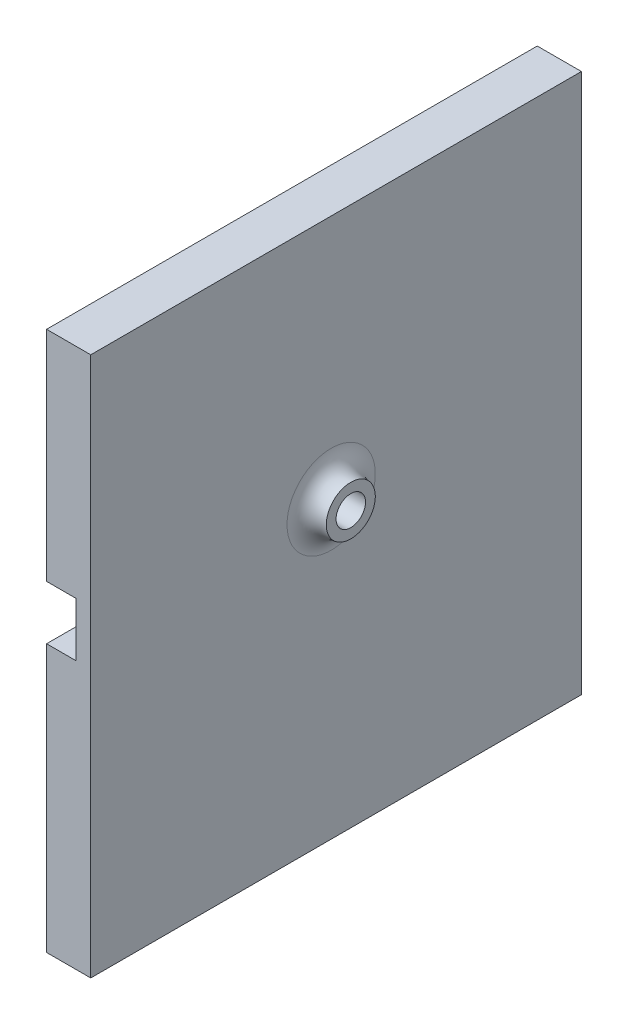
ISO-10303-21;
HEADER;
FILE_DESCRIPTION(('STEP AP214'),'2;1');
FILE_NAME('part.step','',(''),(''),'','','');
FILE_SCHEMA(('AUTOMOTIVE_DESIGN { 1 0 10303 214 1 1 1 1 }'));
ENDSEC;
DATA;
#1=APPLICATION_CONTEXT('core data for automotive mechanical design processes');
#2=APPLICATION_PROTOCOL_DEFINITION('international standard','automotive_design',2000,#1);
#3=PRODUCT_CONTEXT('',#1,'mechanical');
#4=PRODUCT('Part','Part','',(#3));
#5=PRODUCT_RELATED_PRODUCT_CATEGORY('part','',(#4));
#6=PRODUCT_DEFINITION_FORMATION('','',#4);
#7=PRODUCT_DEFINITION_CONTEXT('part definition',#1,'design');
#8=PRODUCT_DEFINITION('design','',#6,#7);
#9=PRODUCT_DEFINITION_SHAPE('','',#8);
#10=(LENGTH_UNIT() NAMED_UNIT(*) SI_UNIT(.MILLI.,.METRE.));
#11=(NAMED_UNIT(*) PLANE_ANGLE_UNIT() SI_UNIT($,.RADIAN.));
#12=(NAMED_UNIT(*) SI_UNIT($,.STERADIAN.) SOLID_ANGLE_UNIT());
#13=UNCERTAINTY_MEASURE_WITH_UNIT(LENGTH_MEASURE(1.E-05),#10,'distance_accuracy_value','');
#14=(GEOMETRIC_REPRESENTATION_CONTEXT(3) GLOBAL_UNCERTAINTY_ASSIGNED_CONTEXT((#13)) GLOBAL_UNIT_ASSIGNED_CONTEXT((#10,
#11,#12)) REPRESENTATION_CONTEXT('',''));
#15=CARTESIAN_POINT('',(0.,0.,0.));
#16=DIRECTION('',(0.,0.,1.));
#17=DIRECTION('',(1.,0.,0.));
#18=AXIS2_PLACEMENT_3D('',#15,#16,#17);
#19=CARTESIAN_POINT('',(37.,-10.,60.));
#20=DIRECTION('',(1.,0.,0.));
#21=DIRECTION('',(0.,0.,-1.));
#22=AXIS2_PLACEMENT_3D('',#19,#20,#21);
#23=PLANE('',#22);
#24=CARTESIAN_POINT('',(37.,-10.,60.));
#25=DIRECTION('',(1.,0.,0.));
#26=DIRECTION('',(0.,0.,-1.));
#27=AXIS2_PLACEMENT_3D('',#24,#25,#26);
#28=CIRCLE('',#27,1.5);
#29=CARTESIAN_POINT('',(37.,-10.,58.5));
#30=VERTEX_POINT('',#29);
#31=EDGE_CURVE('E137',#30,#30,#28,.T.);
#32=ORIENTED_EDGE('',*,*,#31,.F.);
#33=EDGE_LOOP('',(#32));
#34=FACE_BOUND('',#33,.T.);
#35=CARTESIAN_POINT('',(37.,-10.,60.));
#36=DIRECTION('',(1.,0.,0.));
#37=DIRECTION('',(0.,0.,-1.));
#38=AXIS2_PLACEMENT_3D('',#35,#36,#37);
#39=CIRCLE('',#38,2.5);
#40=CARTESIAN_POINT('',(37.,-10.,57.5));
#41=VERTEX_POINT('',#40);
#42=EDGE_CURVE('E141',#41,#41,#39,.T.);
#43=ORIENTED_EDGE('',*,*,#42,.T.);
#44=EDGE_LOOP('',(#43));
#45=FACE_BOUND('',#44,.T.);
#46=ADVANCED_FACE('F50',(#34,#45),#23,.T.);
#47=CARTESIAN_POINT('',(-35.,-10.,60.));
#48=DIRECTION('',(1.,0.,0.));
#49=DIRECTION('',(0.,0.,-1.));
#50=AXIS2_PLACEMENT_3D('',#47,#48,#49);
#51=CYLINDRICAL_SURFACE('',#50,1.5);
#52=CARTESIAN_POINT('',(33.5,-10.,60.));
#53=DIRECTION('',(1.,0.,0.));
#54=DIRECTION('',(0.,0.,-1.));
#55=AXIS2_PLACEMENT_3D('',#52,#53,#54);
#56=CIRCLE('',#55,1.5);
#57=CARTESIAN_POINT('',(33.5,-10.,58.5));
#58=VERTEX_POINT('',#57);
#59=EDGE_CURVE('E173',#58,#58,#56,.F.);
#60=ORIENTED_EDGE('',*,*,#59,.T.);
#61=EDGE_LOOP('',(#60));
#62=FACE_BOUND('',#61,.T.);
#63=ORIENTED_EDGE('',*,*,#31,.T.);
#64=EDGE_LOOP('',(#63));
#65=FACE_BOUND('',#64,.T.);
#66=ADVANCED_FACE('F247',(#62,#65),#51,.F.);
#67=CARTESIAN_POINT('',(37.,-10.,60.));
#68=DIRECTION('',(-1.,0.,0.));
#69=DIRECTION('',(0.,0.,1.));
#70=AXIS2_PLACEMENT_3D('',#67,#68,#69);
#71=TOROIDAL_SURFACE('',#70,4.5,2.);
#72=CARTESIAN_POINT('',(35.,-10.,60.));
#73=DIRECTION('',(-1.,0.,0.));
#74=DIRECTION('',(0.,0.,1.));
#75=AXIS2_PLACEMENT_3D('',#72,#73,#74);
#76=CIRCLE('',#75,4.5);
#77=CARTESIAN_POINT('',(35.,-10.,64.5));
#78=VERTEX_POINT('',#77);
#79=EDGE_CURVE('E205',#78,#78,#76,.T.);
#80=ORIENTED_EDGE('',*,*,#79,.F.);
#81=EDGE_LOOP('',(#80));
#82=FACE_BOUND('',#81,.T.);
#83=ORIENTED_EDGE('',*,*,#42,.F.);
#84=EDGE_LOOP('',(#83));
#85=FACE_BOUND('',#84,.T.);
#86=ADVANCED_FACE('F52',(#82,#85),#71,.F.);
#87=CARTESIAN_POINT('',(0.,0.,54.5));
#88=DIRECTION('',(0.,0.,1.));
#89=DIRECTION('',(1.,0.,0.));
#90=AXIS2_PLACEMENT_3D('',#87,#88,#89);
#91=PLANE('',#90);
#92=DIRECTION('',(0.,-1.,0.));
#93=VECTOR('',#92,1.);
#94=CARTESIAN_POINT('',(30.5,-7.25,54.5));
#95=LINE('',#94,#93);
#96=CARTESIAN_POINT('',(30.5,-7.25,54.5));
#97=VERTEX_POINT('',#96);
#98=CARTESIAN_POINT('',(30.5,-12.75,54.5));
#99=VERTEX_POINT('',#98);
#100=EDGE_CURVE('E166',#97,#99,#95,.T.);
#101=ORIENTED_EDGE('',*,*,#100,.T.);
#102=DIRECTION('',(1.,0.,0.));
#103=VECTOR('',#102,1.);
#104=CARTESIAN_POINT('',(30.5,-12.75,54.5));
#105=LINE('',#104,#103);
#106=CARTESIAN_POINT('',(33.5,-12.75,54.5));
#107=VERTEX_POINT('',#106);
#108=EDGE_CURVE('E181',#99,#107,#105,.T.);
#109=ORIENTED_EDGE('',*,*,#108,.T.);
#110=DIRECTION('',(0.,1.,0.));
#111=VECTOR('',#110,1.);
#112=CARTESIAN_POINT('',(33.5,-7.25,54.5));
#113=LINE('',#112,#111);
#114=CARTESIAN_POINT('',(33.5,-7.25,54.5));
#115=VERTEX_POINT('',#114);
#116=EDGE_CURVE('E177',#107,#115,#113,.T.);
#117=ORIENTED_EDGE('',*,*,#116,.T.);
#118=DIRECTION('',(-1.,0.,0.));
#119=VECTOR('',#118,1.);
#120=CARTESIAN_POINT('',(30.5,-7.25,54.5));
#121=LINE('',#120,#119);
#122=EDGE_CURVE('E151',#115,#97,#121,.T.);
#123=ORIENTED_EDGE('',*,*,#122,.T.);
#124=EDGE_LOOP('',(#101,#109,#117,#123));
#125=FACE_BOUND('',#124,.T.);
#126=ADVANCED_FACE('F223',(#125),#91,.T.);
#127=CARTESIAN_POINT('',(30.5,-12.75,54.5));
#128=DIRECTION('',(0.,-1.,0.));
#129=DIRECTION('',(1.,0.,0.));
#130=AXIS2_PLACEMENT_3D('',#127,#128,#129);
#131=PLANE('',#130);
#132=DIRECTION('',(1.,0.,0.));
#133=VECTOR('',#132,1.);
#134=CARTESIAN_POINT('',(30.5,-12.75,84.5));
#135=LINE('',#134,#133);
#136=CARTESIAN_POINT('',(30.5,-12.75,84.5));
#137=VERTEX_POINT('',#136);
#138=CARTESIAN_POINT('',(33.5,-12.75,84.5));
#139=VERTEX_POINT('',#138);
#140=EDGE_CURVE('E170',#137,#139,#135,.T.);
#141=ORIENTED_EDGE('',*,*,#140,.T.);
#142=DIRECTION('',(0.,0.,1.));
#143=VECTOR('',#142,1.);
#144=CARTESIAN_POINT('',(33.5,-12.75,54.5));
#145=LINE('',#144,#143);
#146=EDGE_CURVE('E152',#107,#139,#145,.T.);
#147=ORIENTED_EDGE('',*,*,#146,.F.);
#148=ORIENTED_EDGE('',*,*,#108,.F.);
#149=DIRECTION('',(0.,0.,1.));
#150=VECTOR('',#149,1.);
#151=CARTESIAN_POINT('',(30.5,-12.75,54.5));
#152=LINE('',#151,#150);
#153=EDGE_CURVE('E74',#99,#137,#152,.T.);
#154=ORIENTED_EDGE('',*,*,#153,.T.);
#155=EDGE_LOOP('',(#141,#147,#148,#154));
#156=FACE_BOUND('',#155,.T.);
#157=ADVANCED_FACE('F260',(#156),#131,.F.);
#158=CARTESIAN_POINT('',(33.5,-7.25,54.5));
#159=DIRECTION('',(1.,0.,0.));
#160=DIRECTION('',(0.,0.,-1.));
#161=AXIS2_PLACEMENT_3D('',#158,#159,#160);
#162=PLANE('',#161);
#163=DIRECTION('',(0.,1.,0.));
#164=VECTOR('',#163,1.);
#165=CARTESIAN_POINT('',(33.5,-7.25,84.5));
#166=LINE('',#165,#164);
#167=CARTESIAN_POINT('',(33.5,-7.25,84.5));
#168=VERTEX_POINT('',#167);
#169=EDGE_CURVE('E165',#139,#168,#166,.T.);
#170=ORIENTED_EDGE('',*,*,#169,.T.);
#171=DIRECTION('',(0.,0.,1.));
#172=VECTOR('',#171,1.);
#173=CARTESIAN_POINT('',(33.5,-7.25,54.5));
#174=LINE('',#173,#172);
#175=EDGE_CURVE('E155',#115,#168,#174,.T.);
#176=ORIENTED_EDGE('',*,*,#175,.F.);
#177=ORIENTED_EDGE('',*,*,#116,.F.);
#178=ORIENTED_EDGE('',*,*,#146,.T.);
#179=EDGE_LOOP('',(#170,#176,#177,#178));
#180=FACE_BOUND('',#179,.T.);
#181=ORIENTED_EDGE('',*,*,#59,.F.);
#182=EDGE_LOOP('',(#181));
#183=FACE_BOUND('',#182,.T.);
#184=ADVANCED_FACE('F226',(#180,#183),#162,.F.);
#185=CARTESIAN_POINT('',(30.5,-7.25,54.5));
#186=DIRECTION('',(0.,1.,0.));
#187=DIRECTION('',(0.,0.,1.));
#188=AXIS2_PLACEMENT_3D('',#185,#186,#187);
#189=PLANE('',#188);
#190=DIRECTION('',(-1.,0.,0.));
#191=VECTOR('',#190,1.);
#192=CARTESIAN_POINT('',(30.5,-7.25,84.5));
#193=LINE('',#192,#191);
#194=CARTESIAN_POINT('',(30.5,-7.25,84.5));
#195=VERTEX_POINT('',#194);
#196=EDGE_CURVE('E161',#168,#195,#193,.T.);
#197=ORIENTED_EDGE('',*,*,#196,.T.);
#198=DIRECTION('',(0.,0.,1.));
#199=VECTOR('',#198,1.);
#200=CARTESIAN_POINT('',(30.5,-7.25,54.5));
#201=LINE('',#200,#199);
#202=EDGE_CURVE('E148',#97,#195,#201,.T.);
#203=ORIENTED_EDGE('',*,*,#202,.F.);
#204=ORIENTED_EDGE('',*,*,#122,.F.);
#205=ORIENTED_EDGE('',*,*,#175,.T.);
#206=EDGE_LOOP('',(#197,#203,#204,#205));
#207=FACE_BOUND('',#206,.T.);
#208=ADVANCED_FACE('F221',(#207),#189,.F.);
#209=CARTESIAN_POINT('',(0.,0.,84.5));
#210=DIRECTION('',(0.,0.,-1.));
#211=DIRECTION('',(-1.,0.,0.));
#212=AXIS2_PLACEMENT_3D('',#209,#210,#211);
#213=PLANE('',#212);
#214=DIRECTION('',(0.,1.,0.));
#215=VECTOR('',#214,1.);
#216=CARTESIAN_POINT('',(35.,40.,84.5));
#217=LINE('',#216,#215);
#218=CARTESIAN_POINT('',(35.,-40.,84.5));
#219=VERTEX_POINT('',#218);
#220=CARTESIAN_POINT('',(35.,15.,84.5));
#221=VERTEX_POINT('',#220);
#222=EDGE_CURVE('E196',#219,#221,#217,.T.);
#223=ORIENTED_EDGE('',*,*,#222,.T.);
#224=DIRECTION('',(-1.,0.,0.));
#225=VECTOR('',#224,1.);
#226=CARTESIAN_POINT('',(0.,15.,84.5));
#227=LINE('',#226,#225);
#228=CARTESIAN_POINT('',(30.5,15.,84.5));
#229=VERTEX_POINT('',#228);
#230=EDGE_CURVE('E59',#221,#229,#227,.T.);
#231=ORIENTED_EDGE('',*,*,#230,.T.);
#232=DIRECTION('',(0.,-1.,0.));
#233=VECTOR('',#232,1.);
#234=CARTESIAN_POINT('',(30.5,-40.,84.5));
#235=LINE('',#234,#233);
#236=EDGE_CURVE('E188',#229,#195,#235,.T.);
#237=ORIENTED_EDGE('',*,*,#236,.T.);
#238=ORIENTED_EDGE('',*,*,#196,.F.);
#239=ORIENTED_EDGE('',*,*,#169,.F.);
#240=ORIENTED_EDGE('',*,*,#140,.F.);
#241=CARTESIAN_POINT('',(30.5,-40.,84.5));
#242=VERTEX_POINT('',#241);
#243=EDGE_CURVE('E192',#137,#242,#235,.T.);
#244=ORIENTED_EDGE('',*,*,#243,.T.);
#245=DIRECTION('',(1.,0.,0.));
#246=VECTOR('',#245,1.);
#247=CARTESIAN_POINT('',(35.,-40.,84.5));
#248=LINE('',#247,#246);
#249=EDGE_CURVE('E191',#242,#219,#248,.T.);
#250=ORIENTED_EDGE('',*,*,#249,.T.);
#251=EDGE_LOOP('',(#223,#231,#237,#238,#239,#240,#244,#250));
#252=FACE_BOUND('',#251,.T.);
#253=ADVANCED_FACE('F214',(#252),#213,.F.);
#254=CARTESIAN_POINT('',(30.5,-40.,84.5));
#255=DIRECTION('',(1.,0.,0.));
#256=DIRECTION('',(0.,1.,0.));
#257=AXIS2_PLACEMENT_3D('',#254,#255,#256);
#258=PLANE('',#257);
#259=ORIENTED_EDGE('',*,*,#236,.F.);
#260=DIRECTION('',(0.,0.,-1.));
#261=VECTOR('',#260,1.);
#262=CARTESIAN_POINT('',(30.5,15.,84.5));
#263=LINE('',#262,#261);
#264=CARTESIAN_POINT('',(30.5,15.,34.5));
#265=VERTEX_POINT('',#264);
#266=EDGE_CURVE('E66',#229,#265,#263,.T.);
#267=ORIENTED_EDGE('',*,*,#266,.T.);
#268=DIRECTION('',(0.,-1.,0.));
#269=VECTOR('',#268,1.);
#270=CARTESIAN_POINT('',(30.5,-40.,34.5));
#271=LINE('',#270,#269);
#272=CARTESIAN_POINT('',(30.5,-40.,34.5));
#273=VERTEX_POINT('',#272);
#274=EDGE_CURVE('E11',#265,#273,#271,.T.);
#275=ORIENTED_EDGE('',*,*,#274,.T.);
#276=DIRECTION('',(0.,0.,-1.));
#277=VECTOR('',#276,1.);
#278=CARTESIAN_POINT('',(30.5,-40.,84.5));
#279=LINE('',#278,#277);
#280=EDGE_CURVE('E199',#242,#273,#279,.T.);
#281=ORIENTED_EDGE('',*,*,#280,.F.);
#282=ORIENTED_EDGE('',*,*,#243,.F.);
#283=ORIENTED_EDGE('',*,*,#153,.F.);
#284=ORIENTED_EDGE('',*,*,#100,.F.);
#285=ORIENTED_EDGE('',*,*,#202,.T.);
#286=EDGE_LOOP('',(#259,#267,#275,#281,#282,#283,#284,#285));
#287=FACE_BOUND('',#286,.T.);
#288=ADVANCED_FACE('F217',(#287),#258,.F.);
#289=CARTESIAN_POINT('',(35.,-40.,4.5));
#290=DIRECTION('',(-1.,0.,0.));
#291=DIRECTION('',(0.,0.,1.));
#292=AXIS2_PLACEMENT_3D('',#289,#290,#291);
#293=PLANE('',#292);
#294=ORIENTED_EDGE('',*,*,#79,.T.);
#295=EDGE_LOOP('',(#294));
#296=FACE_BOUND('',#295,.T.);
#297=DIRECTION('',(0.,1.,0.));
#298=VECTOR('',#297,1.);
#299=CARTESIAN_POINT('',(35.,-40.,34.5));
#300=LINE('',#299,#298);
#301=CARTESIAN_POINT('',(35.,-40.,34.5));
#302=VERTEX_POINT('',#301);
#303=CARTESIAN_POINT('',(35.,15.,34.5));
#304=VERTEX_POINT('',#303);
#305=EDGE_CURVE('E125',#302,#304,#300,.T.);
#306=ORIENTED_EDGE('',*,*,#305,.T.);
#307=DIRECTION('',(0.,0.,1.));
#308=VECTOR('',#307,1.);
#309=CARTESIAN_POINT('',(35.,15.,4.49999999999999));
#310=LINE('',#309,#308);
#311=EDGE_CURVE('E116',#304,#221,#310,.T.);
#312=ORIENTED_EDGE('',*,*,#311,.T.);
#313=ORIENTED_EDGE('',*,*,#222,.F.);
#314=DIRECTION('',(0.,0.,-1.));
#315=VECTOR('',#314,1.);
#316=CARTESIAN_POINT('',(35.,-40.,4.5));
#317=LINE('',#316,#315);
#318=EDGE_CURVE('E135',#219,#302,#317,.T.);
#319=ORIENTED_EDGE('',*,*,#318,.T.);
#320=EDGE_LOOP('',(#306,#312,#313,#319));
#321=FACE_BOUND('',#320,.T.);
#322=ADVANCED_FACE('F134',(#296,#321),#293,.F.);
#323=CARTESIAN_POINT('',(35.,-40.,4.5));
#324=DIRECTION('',(0.,1.,0.));
#325=DIRECTION('',(0.,0.,1.));
#326=AXIS2_PLACEMENT_3D('',#323,#324,#325);
#327=PLANE('',#326);
#328=ORIENTED_EDGE('',*,*,#280,.T.);
#329=DIRECTION('',(-1.,0.,0.));
#330=VECTOR('',#329,1.);
#331=CARTESIAN_POINT('',(37.,-40.,34.5));
#332=LINE('',#331,#330);
#333=EDGE_CURVE('E131',#302,#273,#332,.T.);
#334=ORIENTED_EDGE('',*,*,#333,.F.);
#335=ORIENTED_EDGE('',*,*,#318,.F.);
#336=ORIENTED_EDGE('',*,*,#249,.F.);
#337=EDGE_LOOP('',(#328,#334,#335,#336));
#338=FACE_BOUND('',#337,.T.);
#339=ADVANCED_FACE('F234',(#338),#327,.F.);
#340=CARTESIAN_POINT('',(37.,15.,34.5));
#341=DIRECTION('',(0.,0.,1.));
#342=DIRECTION('',(1.,0.,0.));
#343=AXIS2_PLACEMENT_3D('',#340,#341,#342);
#344=PLANE('',#343);
#345=ORIENTED_EDGE('',*,*,#333,.T.);
#346=ORIENTED_EDGE('',*,*,#274,.F.);
#347=DIRECTION('',(-1.,0.,0.));
#348=VECTOR('',#347,1.);
#349=CARTESIAN_POINT('',(37.,15.,34.5));
#350=LINE('',#349,#348);
#351=EDGE_CURVE('E119',#304,#265,#350,.T.);
#352=ORIENTED_EDGE('',*,*,#351,.F.);
#353=ORIENTED_EDGE('',*,*,#305,.F.);
#354=EDGE_LOOP('',(#345,#346,#352,#353));
#355=FACE_BOUND('',#354,.T.);
#356=ADVANCED_FACE('F128',(#355),#344,.F.);
#357=CARTESIAN_POINT('',(37.,15.,84.5));
#358=DIRECTION('',(0.,-1.,0.));
#359=DIRECTION('',(0.,0.,-1.));
#360=AXIS2_PLACEMENT_3D('',#357,#358,#359);
#361=PLANE('',#360);
#362=ORIENTED_EDGE('',*,*,#351,.T.);
#363=ORIENTED_EDGE('',*,*,#266,.F.);
#364=ORIENTED_EDGE('',*,*,#230,.F.);
#365=ORIENTED_EDGE('',*,*,#311,.F.);
#366=EDGE_LOOP('',(#362,#363,#364,#365));
#367=FACE_BOUND('',#366,.T.);
#368=ADVANCED_FACE('F118',(#367),#361,.F.);
#369=CLOSED_SHELL('',(#46,#66,#86,#126,#157,#184,#208,#253,#288,#322,#339,#356,#368));
#370=MANIFOLD_SOLID_BREP('B2',#369);
#371=ADVANCED_BREP_SHAPE_REPRESENTATION('',(#18,#370),#14);
#372=SHAPE_DEFINITION_REPRESENTATION(#9,#371);
ENDSEC;
END-ISO-10303-21;
